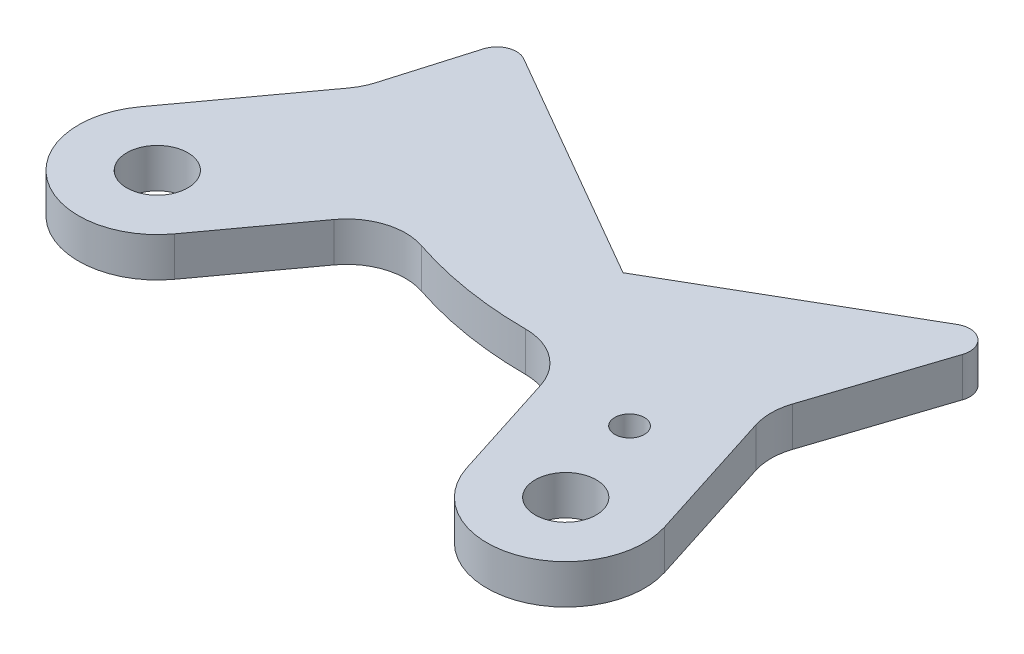
ISO-10303-21;
HEADER;
FILE_DESCRIPTION(('STEP AP214'),'2;1');
FILE_NAME('part.step','',(''),(''),'','','');
FILE_SCHEMA(('AUTOMOTIVE_DESIGN { 1 0 10303 214 1 1 1 1 }'));
ENDSEC;
DATA;
#1=APPLICATION_CONTEXT('core data for automotive mechanical design processes');
#2=APPLICATION_PROTOCOL_DEFINITION('international standard','automotive_design',2000,#1);
#3=PRODUCT_CONTEXT('',#1,'mechanical');
#4=PRODUCT('Part','Part','',(#3));
#5=PRODUCT_RELATED_PRODUCT_CATEGORY('part','',(#4));
#6=PRODUCT_DEFINITION_FORMATION('','',#4);
#7=PRODUCT_DEFINITION_CONTEXT('part definition',#1,'design');
#8=PRODUCT_DEFINITION('design','',#6,#7);
#9=PRODUCT_DEFINITION_SHAPE('','',#8);
#10=(LENGTH_UNIT() NAMED_UNIT(*) SI_UNIT(.MILLI.,.METRE.));
#11=(NAMED_UNIT(*) PLANE_ANGLE_UNIT() SI_UNIT($,.RADIAN.));
#12=(NAMED_UNIT(*) SI_UNIT($,.STERADIAN.) SOLID_ANGLE_UNIT());
#13=UNCERTAINTY_MEASURE_WITH_UNIT(LENGTH_MEASURE(1.E-05),#10,'distance_accuracy_value','');
#14=(GEOMETRIC_REPRESENTATION_CONTEXT(3) GLOBAL_UNCERTAINTY_ASSIGNED_CONTEXT((#13)) GLOBAL_UNIT_ASSIGNED_CONTEXT((#10,
#11,#12)) REPRESENTATION_CONTEXT('',''));
#15=CARTESIAN_POINT('',(0.,0.,0.));
#16=DIRECTION('',(0.,0.,1.));
#17=DIRECTION('',(1.,0.,0.));
#18=AXIS2_PLACEMENT_3D('',#15,#16,#17);
#19=CARTESIAN_POINT('',(-11.920981795953,2.,-8.70254765488495));
#20=DIRECTION('',(0.807679539292025,0.,0.589621710768033));
#21=DIRECTION('',(0.589621710768033,0.,-0.807679539292026));
#22=AXIS2_PLACEMENT_3D('',#19,#20,#21);
#23=PLANE('',#22);
#24=DIRECTION('',(-0.589621710768033,0.,0.807679539292026));
#25=VECTOR('',#24,1.);
#26=CARTESIAN_POINT('',(-11.920981795953,2.,-8.70254765488495));
#27=LINE('',#26,#25);
#28=CARTESIAN_POINT('',(-9.73497063871896,2.,-11.6970040192243));
#29=VERTEX_POINT('',#28);
#30=CARTESIAN_POINT('',(-14.2059725719786,2.,-5.57250636983299));
#31=VERTEX_POINT('',#30);
#32=EDGE_CURVE('E225',#29,#31,#27,.T.);
#33=ORIENTED_EDGE('',*,*,#32,.F.);
#34=DIRECTION('',(0.,-1.,0.));
#35=VECTOR('',#34,1.);
#36=CARTESIAN_POINT('',(-9.73497063871896,0.,-11.6970040192243));
#37=LINE('',#36,#35);
#38=CARTESIAN_POINT('',(-9.73497063871896,0.,-11.6970040192243));
#39=VERTEX_POINT('',#38);
#40=EDGE_CURVE('E305',#29,#39,#37,.T.);
#41=ORIENTED_EDGE('',*,*,#40,.T.);
#42=DIRECTION('',(-0.589621710768033,0.,0.807679539292026));
#43=VECTOR('',#42,1.);
#44=CARTESIAN_POINT('',(-11.920981795953,0.,-8.70254765488495));
#45=LINE('',#44,#43);
#46=CARTESIAN_POINT('',(-14.2059725719786,0.,-5.57250636983299));
#47=VERTEX_POINT('',#46);
#48=EDGE_CURVE('E215',#39,#47,#45,.T.);
#49=ORIENTED_EDGE('',*,*,#48,.T.);
#50=DIRECTION('',(0.,-1.,0.));
#51=VECTOR('',#50,1.);
#52=CARTESIAN_POINT('',(-14.2059725719786,2.,-5.57250636983299));
#53=LINE('',#52,#51);
#54=EDGE_CURVE('E301',#31,#47,#53,.T.);
#55=ORIENTED_EDGE('',*,*,#54,.F.);
#56=EDGE_LOOP('',(#33,#41,#49,#55));
#57=FACE_BOUND('',#56,.T.);
#58=ADVANCED_FACE('F58',(#57),#23,.F.);
#59=CARTESIAN_POINT('',(-10.9752544148105,2.,-3.21401952676085));
#60=DIRECTION('',(0.,-1.,0.));
#61=DIRECTION('',(0.,0.,-1.));
#62=AXIS2_PLACEMENT_3D('',#59,#60,#61);
#63=CYLINDRICAL_SURFACE('',#62,4.00000000000001);
#64=CARTESIAN_POINT('',(-10.9752544148105,0.,-3.21401952676085));
#65=DIRECTION('',(0.,1.,0.));
#66=DIRECTION('',(0.,0.,1.));
#67=AXIS2_PLACEMENT_3D('',#64,#65,#66);
#68=CIRCLE('',#67,4.00000000000001);
#69=CARTESIAN_POINT('',(-7.74453625764238,0.,-0.855532683688701));
#70=VERTEX_POINT('',#69);
#71=EDGE_CURVE('E262',#47,#70,#68,.T.);
#72=ORIENTED_EDGE('',*,*,#71,.T.);
#73=DIRECTION('',(0.,-1.,0.));
#74=VECTOR('',#73,1.);
#75=CARTESIAN_POINT('',(-7.74453625764238,2.,-0.855532683688701));
#76=LINE('',#75,#74);
#77=CARTESIAN_POINT('',(-7.74453625764238,2.,-0.855532683688701));
#78=VERTEX_POINT('',#77);
#79=EDGE_CURVE('E297',#78,#70,#76,.T.);
#80=ORIENTED_EDGE('',*,*,#79,.F.);
#81=CARTESIAN_POINT('',(-10.9752544148105,2.,-3.21401952676085));
#82=DIRECTION('',(0.,1.,0.));
#83=DIRECTION('',(0.,0.,1.));
#84=AXIS2_PLACEMENT_3D('',#81,#82,#83);
#85=CIRCLE('',#84,4.00000000000001);
#86=EDGE_CURVE('E228',#31,#78,#85,.T.);
#87=ORIENTED_EDGE('',*,*,#86,.F.);
#88=ORIENTED_EDGE('',*,*,#54,.T.);
#89=EDGE_LOOP('',(#72,#80,#87,#88));
#90=FACE_BOUND('',#89,.T.);
#91=ADVANCED_FACE('F422',(#90),#63,.T.);
#92=CARTESIAN_POINT('',(-5.45954548161673,2.,-3.98557396874065));
#93=DIRECTION('',(-0.807679539292025,0.,-0.589621710768033));
#94=DIRECTION('',(-0.589621710768033,0.,0.807679539292025));
#95=AXIS2_PLACEMENT_3D('',#92,#93,#94);
#96=PLANE('',#95);
#97=DIRECTION('',(0.589621710768033,0.,-0.807679539292025));
#98=VECTOR('',#97,1.);
#99=CARTESIAN_POINT('',(-5.45954548161673,0.,-3.98557396874065));
#100=LINE('',#99,#98);
#101=CARTESIAN_POINT('',(-4.32997932465112,0.,-5.53288380587244));
#102=VERTEX_POINT('',#101);
#103=EDGE_CURVE('E265',#70,#102,#100,.T.);
#104=ORIENTED_EDGE('',*,*,#103,.T.);
#105=DIRECTION('',(0.,1.,0.));
#106=VECTOR('',#105,1.);
#107=CARTESIAN_POINT('',(-4.32997932465112,2.,-5.53288380587244));
#108=LINE('',#107,#106);
#109=CARTESIAN_POINT('',(-4.32997932465112,2.,-5.53288380587244));
#110=VERTEX_POINT('',#109);
#111=EDGE_CURVE('E319',#102,#110,#108,.T.);
#112=ORIENTED_EDGE('',*,*,#111,.T.);
#113=DIRECTION('',(0.589621710768033,0.,-0.807679539292025));
#114=VECTOR('',#113,1.);
#115=CARTESIAN_POINT('',(-5.45954548161673,2.,-3.98557396874065));
#116=LINE('',#115,#114);
#117=EDGE_CURVE('E232',#78,#110,#116,.T.);
#118=ORIENTED_EDGE('',*,*,#117,.F.);
#119=ORIENTED_EDGE('',*,*,#79,.T.);
#120=EDGE_LOOP('',(#104,#112,#118,#119));
#121=FACE_BOUND('',#120,.T.);
#122=ADVANCED_FACE('F417',(#121),#96,.F.);
#123=CARTESIAN_POINT('',(5.35726697347827,2.,-25.5867427651695));
#124=DIRECTION('',(0.,-1.,0.));
#125=DIRECTION('',(0.,0.,-1.));
#126=AXIS2_PLACEMENT_3D('',#123,#124,#125);
#127=CYLINDRICAL_SURFACE('',#126,20.);
#128=CARTESIAN_POINT('',(5.35726697347827,2.,-25.5867427651695));
#129=DIRECTION('',(0.,1.,0.));
#130=DIRECTION('',(0.,0.,1.));
#131=AXIS2_PLACEMENT_3D('',#128,#129,#130);
#132=CIRCLE('',#131,20.);
#133=CARTESIAN_POINT('',(-0.959435357176782,2.,-6.61046094638588));
#134=VERTEX_POINT('',#133);
#135=CARTESIAN_POINT('',(5.35473098050555,2.,-5.58674292595099));
#136=VERTEX_POINT('',#135);
#137=EDGE_CURVE('E236',#134,#136,#132,.T.);
#138=ORIENTED_EDGE('',*,*,#137,.F.);
#139=DIRECTION('',(0.,-1.,0.));
#140=VECTOR('',#139,1.);
#141=CARTESIAN_POINT('',(-0.959435357176783,2.,-6.61046094638587));
#142=LINE('',#141,#140);
#143=CARTESIAN_POINT('',(-0.959435357176782,0.,-6.61046094638588));
#144=VERTEX_POINT('',#143);
#145=EDGE_CURVE('E315',#134,#144,#142,.T.);
#146=ORIENTED_EDGE('',*,*,#145,.T.);
#147=CARTESIAN_POINT('',(5.35726697347827,0.,-25.5867427651695));
#148=DIRECTION('',(0.,1.,0.));
#149=DIRECTION('',(0.,0.,1.));
#150=AXIS2_PLACEMENT_3D('',#147,#148,#149);
#151=CIRCLE('',#150,20.);
#152=CARTESIAN_POINT('',(5.35473098050555,0.,-5.58674292595099));
#153=VERTEX_POINT('',#152);
#154=EDGE_CURVE('E269',#144,#153,#151,.T.);
#155=ORIENTED_EDGE('',*,*,#154,.T.);
#156=DIRECTION('',(0.,-1.,0.));
#157=VECTOR('',#156,1.);
#158=CARTESIAN_POINT('',(5.35473098050555,2.,-5.58674292595099));
#159=LINE('',#158,#157);
#160=EDGE_CURVE('E312',#153,#136,#159,.F.);
#161=ORIENTED_EDGE('',*,*,#160,.T.);
#162=EDGE_LOOP('',(#138,#146,#155,#161));
#163=FACE_BOUND('',#162,.T.);
#164=ADVANCED_FACE('F408',(#163),#127,.T.);
#165=CARTESIAN_POINT('',(8.46623721619208,2.,-2.70382058589086));
#166=DIRECTION('',(-0.952599553113903,0.,0.304227039244038));
#167=DIRECTION('',(0.304227039244038,0.,0.952599553113903));
#168=AXIS2_PLACEMENT_3D('',#165,#166,#167);
#169=PLANE('',#168);
#170=DIRECTION('',(-0.304227039244038,0.,-0.952599553113902));
#171=VECTOR('',#170,1.);
#172=CARTESIAN_POINT('',(8.46623721619208,2.,-2.70382058589086));
#173=LINE('',#172,#171);
#174=CARTESIAN_POINT('',(9.97395774809266,2.,2.01717301309372));
#175=VERTEX_POINT('',#174);
#176=CARTESIAN_POINT('',(8.21214924090135,2.,-3.49942406780033));
#177=VERTEX_POINT('',#176);
#178=EDGE_CURVE('E240',#175,#177,#173,.T.);
#179=ORIENTED_EDGE('',*,*,#178,.T.);
#180=DIRECTION('',(0.,-1.,0.));
#181=VECTOR('',#180,1.);
#182=CARTESIAN_POINT('',(8.21214924090135,2.,-3.49942406780033));
#183=LINE('',#182,#181);
#184=CARTESIAN_POINT('',(8.21214924090135,0.,-3.49942406780033));
#185=VERTEX_POINT('',#184);
#186=EDGE_CURVE('E322',#177,#185,#183,.T.);
#187=ORIENTED_EDGE('',*,*,#186,.T.);
#188=DIRECTION('',(-0.304227039244038,0.,-0.952599553113902));
#189=VECTOR('',#188,1.);
#190=CARTESIAN_POINT('',(8.46623721619208,0.,-2.70382058589086));
#191=LINE('',#190,#189);
#192=CARTESIAN_POINT('',(9.97395774809266,0.,2.01717301309372));
#193=VERTEX_POINT('',#192);
#194=EDGE_CURVE('E273',#193,#185,#191,.T.);
#195=ORIENTED_EDGE('',*,*,#194,.F.);
#196=DIRECTION('',(0.,-1.,0.));
#197=VECTOR('',#196,1.);
#198=CARTESIAN_POINT('',(9.97395774809266,2.,2.01717301309372));
#199=LINE('',#198,#197);
#200=EDGE_CURVE('E294',#175,#193,#199,.T.);
#201=ORIENTED_EDGE('',*,*,#200,.F.);
#202=EDGE_LOOP('',(#179,#187,#195,#201));
#203=FACE_BOUND('',#202,.T.);
#204=ADVANCED_FACE('F399',(#203),#169,.T.);
#205=CARTESIAN_POINT('',(13.7843559605483,2.,0.800264856117561));
#206=DIRECTION('',(0.,-1.,0.));
#207=DIRECTION('',(0.,0.,-1.));
#208=AXIS2_PLACEMENT_3D('',#205,#206,#207);
#209=CYLINDRICAL_SURFACE('',#208,4.00000000000002);
#210=CARTESIAN_POINT('',(13.7843559605483,0.,0.800264856117561));
#211=DIRECTION('',(0.,1.,0.));
#212=DIRECTION('',(0.,0.,1.));
#213=AXIS2_PLACEMENT_3D('',#210,#211,#212);
#214=CIRCLE('',#213,4.00000000000002);
#215=CARTESIAN_POINT('',(17.5947541730039,0.,-0.416643300858593));
#216=VERTEX_POINT('',#215);
#217=EDGE_CURVE('E277',#193,#216,#214,.T.);
#218=ORIENTED_EDGE('',*,*,#217,.T.);
#219=DIRECTION('',(0.,-1.,0.));
#220=VECTOR('',#219,1.);
#221=CARTESIAN_POINT('',(17.5947541730039,2.,-0.416643300858593));
#222=LINE('',#221,#220);
#223=CARTESIAN_POINT('',(17.5947541730039,2.,-0.416643300858593));
#224=VERTEX_POINT('',#223);
#225=EDGE_CURVE('E259',#224,#216,#222,.T.);
#226=ORIENTED_EDGE('',*,*,#225,.F.);
#227=CARTESIAN_POINT('',(13.7843559605483,2.,0.800264856117561));
#228=DIRECTION('',(0.,1.,0.));
#229=DIRECTION('',(0.,0.,1.));
#230=AXIS2_PLACEMENT_3D('',#227,#228,#229);
#231=CIRCLE('',#230,4.00000000000002);
#232=EDGE_CURVE('E244',#175,#224,#231,.T.);
#233=ORIENTED_EDGE('',*,*,#232,.F.);
#234=ORIENTED_EDGE('',*,*,#200,.T.);
#235=EDGE_LOOP('',(#218,#226,#233,#234));
#236=FACE_BOUND('',#235,.T.);
#237=ADVANCED_FACE('F395',(#236),#209,.T.);
#238=CARTESIAN_POINT('',(16.0870336411034,2.,-5.13763689984319));
#239=DIRECTION('',(-0.952599553113902,0.,0.304227039244038));
#240=DIRECTION('',(0.304227039244038,0.,0.952599553113902));
#241=AXIS2_PLACEMENT_3D('',#238,#239,#240);
#242=PLANE('',#241);
#243=DIRECTION('',(-0.304227039244038,0.,-0.952599553113903));
#244=VECTOR('',#243,1.);
#245=CARTESIAN_POINT('',(16.0870336411034,0.,-5.13763689984319));
#246=LINE('',#245,#244);
#247=CARTESIAN_POINT('',(15.4249727186927,0.,-7.21069043377549));
#248=VERTEX_POINT('',#247);
#249=EDGE_CURVE('E280',#216,#248,#246,.T.);
#250=ORIENTED_EDGE('',*,*,#249,.T.);
#251=DIRECTION('',(0.,-1.,0.));
#252=VECTOR('',#251,1.);
#253=CARTESIAN_POINT('',(15.4249727186927,2.,-7.21069043377549));
#254=LINE('',#253,#252);
#255=CARTESIAN_POINT('',(15.4249727186927,2.,-7.21069043377549));
#256=VERTEX_POINT('',#255);
#257=EDGE_CURVE('E330',#248,#256,#254,.F.);
#258=ORIENTED_EDGE('',*,*,#257,.T.);
#259=DIRECTION('',(-0.304227039244038,0.,-0.952599553113903));
#260=VECTOR('',#259,1.);
#261=CARTESIAN_POINT('',(16.0870336411034,2.,-5.13763689984319));
#262=LINE('',#261,#260);
#263=EDGE_CURVE('E247',#224,#256,#262,.T.);
#264=ORIENTED_EDGE('',*,*,#263,.F.);
#265=ORIENTED_EDGE('',*,*,#225,.T.);
#266=EDGE_LOOP('',(#250,#258,#264,#265));
#267=FACE_BOUND('',#266,.T.);
#268=ADVANCED_FACE('F391',(#267),#242,.F.);
#269=CARTESIAN_POINT('',(13.7843559605483,2.,0.800264856117561));
#270=DIRECTION('',(0.,-1.,0.));
#271=DIRECTION('',(0.,0.,-1.));
#272=AXIS2_PLACEMENT_3D('',#269,#270,#271);
#273=CYLINDRICAL_SURFACE('',#272,1.55);
#274=CARTESIAN_POINT('',(13.7843559605483,2.,0.800264856117561));
#275=DIRECTION('',(0.,1.,0.));
#276=DIRECTION('',(0.,0.,1.));
#277=AXIS2_PLACEMENT_3D('',#274,#275,#276);
#278=CIRCLE('',#277,1.55);
#279=CARTESIAN_POINT('',(13.7843559605483,2.,2.35026485611756));
#280=VERTEX_POINT('',#279);
#281=EDGE_CURVE('E251',#280,#280,#278,.T.);
#282=ORIENTED_EDGE('',*,*,#281,.T.);
#283=EDGE_LOOP('',(#282));
#284=FACE_BOUND('',#283,.T.);
#285=CARTESIAN_POINT('',(13.7843559605483,0.,0.800264856117561));
#286=DIRECTION('',(0.,1.,0.));
#287=DIRECTION('',(0.,0.,1.));
#288=AXIS2_PLACEMENT_3D('',#285,#286,#287);
#289=CIRCLE('',#288,1.55);
#290=CARTESIAN_POINT('',(13.7843559605483,0.,2.35026485611756));
#291=VERTEX_POINT('',#290);
#292=EDGE_CURVE('E284',#291,#291,#289,.T.);
#293=ORIENTED_EDGE('',*,*,#292,.F.);
#294=EDGE_LOOP('',(#293));
#295=FACE_BOUND('',#294,.T.);
#296=ADVANCED_FACE('F601',(#284,#295),#273,.F.);
#297=CARTESIAN_POINT('',(-10.9752544148105,2.,-3.21401952676085));
#298=DIRECTION('',(0.,-1.,0.));
#299=DIRECTION('',(0.,0.,-1.));
#300=AXIS2_PLACEMENT_3D('',#297,#298,#299);
#301=CYLINDRICAL_SURFACE('',#300,1.55);
#302=CARTESIAN_POINT('',(-10.9752544148105,2.,-3.21401952676085));
#303=DIRECTION('',(0.,1.,0.));
#304=DIRECTION('',(0.,0.,1.));
#305=AXIS2_PLACEMENT_3D('',#302,#303,#304);
#306=CIRCLE('',#305,1.55);
#307=CARTESIAN_POINT('',(-10.9752544148105,2.,-1.66401952676085));
#308=VERTEX_POINT('',#307);
#309=EDGE_CURVE('E255',#308,#308,#306,.T.);
#310=ORIENTED_EDGE('',*,*,#309,.T.);
#311=EDGE_LOOP('',(#310));
#312=FACE_BOUND('',#311,.T.);
#313=CARTESIAN_POINT('',(-10.9752544148105,0.,-3.21401952676085));
#314=DIRECTION('',(0.,1.,0.));
#315=DIRECTION('',(0.,0.,1.));
#316=AXIS2_PLACEMENT_3D('',#313,#314,#315);
#317=CIRCLE('',#316,1.55);
#318=CARTESIAN_POINT('',(-10.9752544148105,0.,-1.66401952676085));
#319=VERTEX_POINT('',#318);
#320=EDGE_CURVE('E229',#319,#319,#317,.T.);
#321=ORIENTED_EDGE('',*,*,#320,.F.);
#322=EDGE_LOOP('',(#321));
#323=FACE_BOUND('',#322,.T.);
#324=ADVANCED_FACE('F530',(#312,#323),#301,.F.);
#325=CARTESIAN_POINT('',(0.,2.,0.));
#326=DIRECTION('',(0.,1.,0.));
#327=DIRECTION('',(0.,0.,1.));
#328=AXIS2_PLACEMENT_3D('',#325,#326,#327);
#329=PLANE('',#328);
#330=CARTESIAN_POINT('',(12.2632207643281,2.,-3.96273290945195));
#331=DIRECTION('',(0.,1.,0.));
#332=DIRECTION('',(0.,0.,1.));
#333=AXIS2_PLACEMENT_3D('',#330,#331,#332);
#334=CIRCLE('',#333,0.75);
#335=CARTESIAN_POINT('',(12.2632207643281,2.,-3.21273290945195));
#336=VERTEX_POINT('',#335);
#337=EDGE_CURVE('E206',#336,#336,#334,.T.);
#338=ORIENTED_EDGE('',*,*,#337,.F.);
#339=EDGE_LOOP('',(#338));
#340=FACE_BOUND('',#339,.T.);
#341=DIRECTION('',(0.866025403784439,0.,0.5));
#342=VECTOR('',#341,1.);
#343=CARTESIAN_POINT('',(5.90186019725889,2.,-10.2223217208209));
#344=LINE('',#343,#342);
#345=CARTESIAN_POINT('',(-6.57622253757224,2.,-17.4265461467461));
#346=VERTEX_POINT('',#345);
#347=CARTESIAN_POINT('',(5.35726697347828,2.,-10.5367427651695));
#348=VERTEX_POINT('',#347);
#349=EDGE_CURVE('E179',#346,#348,#344,.T.);
#350=ORIENTED_EDGE('',*,*,#349,.F.);
#351=CARTESIAN_POINT('',(-7.07622253757224,2.,-16.5605207429616));
#352=DIRECTION('',(0.,1.,0.));
#353=DIRECTION('',(0.,0.,1.));
#354=AXIS2_PLACEMENT_3D('',#351,#352,#353);
#355=CIRCLE('',#354,1.);
#356=CARTESIAN_POINT('',(-8.03545437580635,2.,-16.8431411253087));
#357=VERTEX_POINT('',#356);
#358=EDGE_CURVE('E362',#346,#357,#355,.T.);
#359=ORIENTED_EDGE('',*,*,#358,.T.);
#360=DIRECTION('',(0.282620382347096,0.,-0.959231838234106));
#361=VECTOR('',#360,1.);
#362=CARTESIAN_POINT('',(-11.9597780091251,2.,-3.52373315709357));
#363=LINE('',#362,#361);
#364=CARTESIAN_POINT('',(-9.28031374189272,2.,-12.6180080044871));
#365=VERTEX_POINT('',#364);
#366=EDGE_CURVE('E216',#365,#357,#363,.T.);
#367=ORIENTED_EDGE('',*,*,#366,.F.);
#368=CARTESIAN_POINT('',(-12.158009256595,2.,-13.4658691515284));
#369=DIRECTION('',(0.,1.,0.));
#370=DIRECTION('',(0.,0.,1.));
#371=AXIS2_PLACEMENT_3D('',#368,#369,#370);
#372=CIRCLE('',#371,3.);
#373=EDGE_CURVE('E336',#365,#29,#372,.F.);
#374=ORIENTED_EDGE('',*,*,#373,.T.);
#375=ORIENTED_EDGE('',*,*,#32,.T.);
#376=ORIENTED_EDGE('',*,*,#86,.T.);
#377=ORIENTED_EDGE('',*,*,#117,.T.);
#378=CARTESIAN_POINT('',(-1.90694070677504,2.,-3.76401867356834));
#379=DIRECTION('',(0.,1.,0.));
#380=DIRECTION('',(0.,0.,1.));
#381=AXIS2_PLACEMENT_3D('',#378,#379,#380);
#382=CIRCLE('',#381,3.);
#383=EDGE_CURVE('E342',#110,#134,#382,.F.);
#384=ORIENTED_EDGE('',*,*,#383,.T.);
#385=ORIENTED_EDGE('',*,*,#137,.T.);
#386=CARTESIAN_POINT('',(5.35435058155964,2.,-2.58674295006821));
#387=DIRECTION('',(0.,1.,0.));
#388=DIRECTION('',(0.,0.,1.));
#389=AXIS2_PLACEMENT_3D('',#386,#387,#388);
#390=CIRCLE('',#389,3.);
#391=EDGE_CURVE('E348',#136,#177,#390,.F.);
#392=ORIENTED_EDGE('',*,*,#391,.T.);
#393=ORIENTED_EDGE('',*,*,#178,.F.);
#394=ORIENTED_EDGE('',*,*,#232,.T.);
#395=ORIENTED_EDGE('',*,*,#263,.T.);
#396=CARTESIAN_POINT('',(18.2827713780344,2.,-8.1233715515076));
#397=DIRECTION('',(0.,1.,0.));
#398=DIRECTION('',(0.,0.,1.));
#399=AXIS2_PLACEMENT_3D('',#396,#397,#398);
#400=CIRCLE('',#399,3.);
#401=CARTESIAN_POINT('',(15.432723296155,2.,-9.05997495262037));
#402=VERTEX_POINT('',#401);
#403=EDGE_CURVE('E354',#256,#402,#400,.F.);
#404=ORIENTED_EDGE('',*,*,#403,.T.);
#405=DIRECTION('',(-0.312201133704257,0.,0.950016027293106));
#406=VECTOR('',#405,1.);
#407=CARTESIAN_POINT('',(11.2413496711117,2.,3.69421358257174));
#408=LINE('',#407,#406);
#409=CARTESIAN_POINT('',(17.5735480559117,2.,-15.5744222554329));
#410=VERTEX_POINT('',#409);
#411=EDGE_CURVE('E209',#410,#402,#408,.T.);
#412=ORIENTED_EDGE('',*,*,#411,.F.);
#413=CARTESIAN_POINT('',(16.6235320286186,2.,-15.8866233891371));
#414=DIRECTION('',(0.,1.,0.));
#415=DIRECTION('',(0.,0.,1.));
#416=AXIS2_PLACEMENT_3D('',#413,#414,#415);
#417=CIRCLE('',#416,1.);
#418=CARTESIAN_POINT('',(16.1235320286186,2.,-16.7526487929216));
#419=VERTEX_POINT('',#418);
#420=EDGE_CURVE('E200',#410,#419,#417,.T.);
#421=ORIENTED_EDGE('',*,*,#420,.T.);
#422=DIRECTION('',(0.866025403784439,0.,-0.5));
#423=VECTOR('',#422,1.);
#424=CARTESIAN_POINT('',(-3.22322671051976,2.,-5.58279242693332));
#425=LINE('',#424,#423);
#426=EDGE_CURVE('E189',#348,#419,#425,.T.);
#427=ORIENTED_EDGE('',*,*,#426,.F.);
#428=EDGE_LOOP('',(#350,#359,#367,#374,#375,#376,#377,#384,#385,#392,#393,#394,#395,#404,#412,
#421,#427));
#429=FACE_BOUND('',#428,.T.);
#430=ORIENTED_EDGE('',*,*,#281,.F.);
#431=EDGE_LOOP('',(#430));
#432=FACE_BOUND('',#431,.T.);
#433=ORIENTED_EDGE('',*,*,#309,.F.);
#434=EDGE_LOOP('',(#433));
#435=FACE_BOUND('',#434,.T.);
#436=ADVANCED_FACE('F197',(#340,#429,#432,#435),#329,.T.);
#437=CARTESIAN_POINT('',(0.,0.,0.));
#438=DIRECTION('',(0.,1.,0.));
#439=DIRECTION('',(0.,0.,1.));
#440=AXIS2_PLACEMENT_3D('',#437,#438,#439);
#441=PLANE('',#440);
#442=CARTESIAN_POINT('',(12.2632207643281,0.,-3.96273290945195));
#443=DIRECTION('',(0.,1.,0.));
#444=DIRECTION('',(0.,0.,1.));
#445=AXIS2_PLACEMENT_3D('',#442,#443,#444);
#446=CIRCLE('',#445,0.75);
#447=CARTESIAN_POINT('',(12.2632207643281,0.,-3.21273290945195));
#448=VERTEX_POINT('',#447);
#449=EDGE_CURVE('E62',#448,#448,#446,.T.);
#450=ORIENTED_EDGE('',*,*,#449,.T.);
#451=EDGE_LOOP('',(#450));
#452=FACE_BOUND('',#451,.T.);
#453=DIRECTION('',(0.282620382347096,0.,-0.959231838234106));
#454=VECTOR('',#453,1.);
#455=CARTESIAN_POINT('',(-11.9597780091251,0.,-3.52373315709357));
#456=LINE('',#455,#454);
#457=CARTESIAN_POINT('',(-9.28031374189272,0.,-12.6180080044871));
#458=VERTEX_POINT('',#457);
#459=CARTESIAN_POINT('',(-8.03545437580635,0.,-16.8431411253087));
#460=VERTEX_POINT('',#459);
#461=EDGE_CURVE('E211',#458,#460,#456,.T.);
#462=ORIENTED_EDGE('',*,*,#461,.T.);
#463=CARTESIAN_POINT('',(-7.07622253757224,0.,-16.5605207429616));
#464=DIRECTION('',(0.,1.,0.));
#465=DIRECTION('',(0.,0.,1.));
#466=AXIS2_PLACEMENT_3D('',#463,#464,#465);
#467=CIRCLE('',#466,1.);
#468=CARTESIAN_POINT('',(-6.57622253757224,0.,-17.4265461467461));
#469=VERTEX_POINT('',#468);
#470=EDGE_CURVE('E370',#460,#469,#467,.F.);
#471=ORIENTED_EDGE('',*,*,#470,.T.);
#472=DIRECTION('',(-0.866025403784439,0.,-0.5));
#473=VECTOR('',#472,1.);
#474=CARTESIAN_POINT('',(5.90186019725889,0.,-10.2223217208209));
#475=LINE('',#474,#473);
#476=CARTESIAN_POINT('',(5.35726697347827,0.,-10.5367427651695));
#477=VERTEX_POINT('',#476);
#478=EDGE_CURVE('E195',#477,#469,#475,.T.);
#479=ORIENTED_EDGE('',*,*,#478,.F.);
#480=DIRECTION('',(-0.866025403784439,0.,0.5));
#481=VECTOR('',#480,1.);
#482=CARTESIAN_POINT('',(-3.22322671051976,0.,-5.58279242693332));
#483=LINE('',#482,#481);
#484=CARTESIAN_POINT('',(16.1235320286186,0.,-16.7526487929216));
#485=VERTEX_POINT('',#484);
#486=EDGE_CURVE('E192',#485,#477,#483,.T.);
#487=ORIENTED_EDGE('',*,*,#486,.F.);
#488=CARTESIAN_POINT('',(16.6235320286186,0.,-15.8866233891371));
#489=DIRECTION('',(0.,1.,0.));
#490=DIRECTION('',(0.,0.,1.));
#491=AXIS2_PLACEMENT_3D('',#488,#489,#490);
#492=CIRCLE('',#491,1.);
#493=CARTESIAN_POINT('',(17.5735480559117,0.,-15.5744222554329));
#494=VERTEX_POINT('',#493);
#495=EDGE_CURVE('E75',#485,#494,#492,.F.);
#496=ORIENTED_EDGE('',*,*,#495,.T.);
#497=DIRECTION('',(-0.312201133704257,0.,0.950016027293106));
#498=VECTOR('',#497,1.);
#499=CARTESIAN_POINT('',(11.2413496711117,0.,3.69421358257174));
#500=LINE('',#499,#498);
#501=CARTESIAN_POINT('',(15.432723296155,0.,-9.05997495262037));
#502=VERTEX_POINT('',#501);
#503=EDGE_CURVE('E220',#494,#502,#500,.T.);
#504=ORIENTED_EDGE('',*,*,#503,.T.);
#505=CARTESIAN_POINT('',(18.2827713780344,0.,-8.1233715515076));
#506=DIRECTION('',(0.,1.,0.));
#507=DIRECTION('',(0.,0.,1.));
#508=AXIS2_PLACEMENT_3D('',#505,#506,#507);
#509=CIRCLE('',#508,3.);
#510=EDGE_CURVE('E351',#502,#248,#509,.T.);
#511=ORIENTED_EDGE('',*,*,#510,.T.);
#512=ORIENTED_EDGE('',*,*,#249,.F.);
#513=ORIENTED_EDGE('',*,*,#217,.F.);
#514=ORIENTED_EDGE('',*,*,#194,.T.);
#515=CARTESIAN_POINT('',(5.35435058155964,0.,-2.58674295006821));
#516=DIRECTION('',(0.,1.,0.));
#517=DIRECTION('',(0.,0.,1.));
#518=AXIS2_PLACEMENT_3D('',#515,#516,#517);
#519=CIRCLE('',#518,3.);
#520=EDGE_CURVE('E345',#185,#153,#519,.T.);
#521=ORIENTED_EDGE('',*,*,#520,.T.);
#522=ORIENTED_EDGE('',*,*,#154,.F.);
#523=CARTESIAN_POINT('',(-1.90694070677504,0.,-3.76401867356834));
#524=DIRECTION('',(0.,1.,0.));
#525=DIRECTION('',(0.,0.,1.));
#526=AXIS2_PLACEMENT_3D('',#523,#524,#525);
#527=CIRCLE('',#526,3.);
#528=EDGE_CURVE('E339',#144,#102,#527,.T.);
#529=ORIENTED_EDGE('',*,*,#528,.T.);
#530=ORIENTED_EDGE('',*,*,#103,.F.);
#531=ORIENTED_EDGE('',*,*,#71,.F.);
#532=ORIENTED_EDGE('',*,*,#48,.F.);
#533=CARTESIAN_POINT('',(-12.158009256595,0.,-13.4658691515284));
#534=DIRECTION('',(0.,1.,0.));
#535=DIRECTION('',(0.,0.,1.));
#536=AXIS2_PLACEMENT_3D('',#533,#534,#535);
#537=CIRCLE('',#536,3.);
#538=EDGE_CURVE('E333',#39,#458,#537,.T.);
#539=ORIENTED_EDGE('',*,*,#538,.T.);
#540=EDGE_LOOP('',(#462,#471,#479,#487,#496,#504,#511,#512,#513,#514,#521,#522,#529,#530,#531,
#532,#539));
#541=FACE_BOUND('',#540,.T.);
#542=ORIENTED_EDGE('',*,*,#292,.T.);
#543=EDGE_LOOP('',(#542));
#544=FACE_BOUND('',#543,.T.);
#545=ORIENTED_EDGE('',*,*,#320,.T.);
#546=EDGE_LOOP('',(#545));
#547=FACE_BOUND('',#546,.T.);
#548=ADVANCED_FACE('F387',(#452,#541,#544,#547),#441,.F.);
#549=CARTESIAN_POINT('',(11.2413496711117,0.,3.69421358257174));
#550=DIRECTION('',(-0.950016027293106,0.,-0.312201133704258));
#551=DIRECTION('',(-0.312201133704258,0.,0.950016027293106));
#552=AXIS2_PLACEMENT_3D('',#549,#550,#551);
#553=PLANE('',#552);
#554=ORIENTED_EDGE('',*,*,#503,.F.);
#555=DIRECTION('',(0.,1.,0.));
#556=VECTOR('',#555,1.);
#557=CARTESIAN_POINT('',(17.5735480559117,0.,-15.5744222554329));
#558=LINE('',#557,#556);
#559=EDGE_CURVE('E68',#494,#410,#558,.T.);
#560=ORIENTED_EDGE('',*,*,#559,.T.);
#561=ORIENTED_EDGE('',*,*,#411,.T.);
#562=DIRECTION('',(0.,-1.,0.));
#563=VECTOR('',#562,1.);
#564=CARTESIAN_POINT('',(15.432723296155,0.,-9.05997495262038));
#565=LINE('',#564,#563);
#566=EDGE_CURVE('E326',#402,#502,#565,.T.);
#567=ORIENTED_EDGE('',*,*,#566,.T.);
#568=EDGE_LOOP('',(#554,#560,#561,#567));
#569=FACE_BOUND('',#568,.T.);
#570=ADVANCED_FACE('F377',(#569),#553,.F.);
#571=CARTESIAN_POINT('',(-11.9597780091251,0.,-3.52373315709357));
#572=DIRECTION('',(0.959231838234106,0.,0.282620382347096));
#573=DIRECTION('',(0.282620382347096,0.,-0.959231838234106));
#574=AXIS2_PLACEMENT_3D('',#571,#572,#573);
#575=PLANE('',#574);
#576=ORIENTED_EDGE('',*,*,#366,.T.);
#577=DIRECTION('',(0.,1.,0.));
#578=VECTOR('',#577,1.);
#579=CARTESIAN_POINT('',(-8.03545437580635,0.,-16.8431411253087));
#580=LINE('',#579,#578);
#581=EDGE_CURVE('E365',#357,#460,#580,.F.);
#582=ORIENTED_EDGE('',*,*,#581,.T.);
#583=ORIENTED_EDGE('',*,*,#461,.F.);
#584=DIRECTION('',(0.,-1.,0.));
#585=VECTOR('',#584,1.);
#586=CARTESIAN_POINT('',(-9.28031374189272,2.,-12.6180080044871));
#587=LINE('',#586,#585);
#588=EDGE_CURVE('E309',#458,#365,#587,.F.);
#589=ORIENTED_EDGE('',*,*,#588,.T.);
#590=EDGE_LOOP('',(#576,#582,#583,#589));
#591=FACE_BOUND('',#590,.T.);
#592=ADVANCED_FACE('F435',(#591),#575,.F.);
#593=CARTESIAN_POINT('',(5.90186019725889,-15.05,-10.2223217208209));
#594=DIRECTION('',(-0.5,0.,0.866025403784439));
#595=DIRECTION('',(0.866025403784439,0.,0.5));
#596=AXIS2_PLACEMENT_3D('',#593,#594,#595);
#597=PLANE('',#596);
#598=ORIENTED_EDGE('',*,*,#478,.T.);
#599=DIRECTION('',(0.,1.,0.));
#600=VECTOR('',#599,1.);
#601=CARTESIAN_POINT('',(-6.57622253757224,-15.05,-17.4265461467461));
#602=LINE('',#601,#600);
#603=EDGE_CURVE('E185',#469,#346,#602,.T.);
#604=ORIENTED_EDGE('',*,*,#603,.T.);
#605=ORIENTED_EDGE('',*,*,#349,.T.);
#606=DIRECTION('',(0.,1.,0.));
#607=VECTOR('',#606,1.);
#608=CARTESIAN_POINT('',(5.35726697347828,-15.05,-10.5367427651695));
#609=LINE('',#608,#607);
#610=EDGE_CURVE('E183',#477,#348,#609,.T.);
#611=ORIENTED_EDGE('',*,*,#610,.F.);
#612=EDGE_LOOP('',(#598,#604,#605,#611));
#613=FACE_BOUND('',#612,.T.);
#614=ADVANCED_FACE('F182',(#613),#597,.F.);
#615=CARTESIAN_POINT('',(-3.22322671051976,-15.05,-5.58279242693332));
#616=DIRECTION('',(0.5,0.,0.866025403784439));
#617=DIRECTION('',(0.866025403784439,0.,-0.5));
#618=AXIS2_PLACEMENT_3D('',#615,#616,#617);
#619=PLANE('',#618);
#620=ORIENTED_EDGE('',*,*,#426,.T.);
#621=DIRECTION('',(0.,1.,0.));
#622=VECTOR('',#621,1.);
#623=CARTESIAN_POINT('',(16.1235320286186,-15.05,-16.7526487929216));
#624=LINE('',#623,#622);
#625=EDGE_CURVE('E12',#419,#485,#624,.F.);
#626=ORIENTED_EDGE('',*,*,#625,.T.);
#627=ORIENTED_EDGE('',*,*,#486,.T.);
#628=ORIENTED_EDGE('',*,*,#610,.T.);
#629=EDGE_LOOP('',(#620,#626,#627,#628));
#630=FACE_BOUND('',#629,.T.);
#631=ADVANCED_FACE('F191',(#630),#619,.F.);
#632=CARTESIAN_POINT('',(-12.158009256595,2.,-13.4658691515284));
#633=DIRECTION('',(0.,1.,0.));
#634=DIRECTION('',(0.,0.,1.));
#635=AXIS2_PLACEMENT_3D('',#632,#633,#634);
#636=CYLINDRICAL_SURFACE('',#635,3.);
#637=ORIENTED_EDGE('',*,*,#373,.F.);
#638=ORIENTED_EDGE('',*,*,#588,.F.);
#639=ORIENTED_EDGE('',*,*,#538,.F.);
#640=ORIENTED_EDGE('',*,*,#40,.F.);
#641=EDGE_LOOP('',(#637,#638,#639,#640));
#642=FACE_BOUND('',#641,.T.);
#643=ADVANCED_FACE('F431',(#642),#636,.F.);
#644=CARTESIAN_POINT('',(-1.90694070677504,2.,-3.76401867356834));
#645=DIRECTION('',(0.,-1.,0.));
#646=DIRECTION('',(0.,0.,-1.));
#647=AXIS2_PLACEMENT_3D('',#644,#645,#646);
#648=CYLINDRICAL_SURFACE('',#647,3.);
#649=ORIENTED_EDGE('',*,*,#383,.F.);
#650=ORIENTED_EDGE('',*,*,#111,.F.);
#651=ORIENTED_EDGE('',*,*,#528,.F.);
#652=ORIENTED_EDGE('',*,*,#145,.F.);
#653=EDGE_LOOP('',(#649,#650,#651,#652));
#654=FACE_BOUND('',#653,.T.);
#655=ADVANCED_FACE('F412',(#654),#648,.F.);
#656=CARTESIAN_POINT('',(5.35435058155964,2.,-2.58674295006821));
#657=DIRECTION('',(0.,-1.,0.));
#658=DIRECTION('',(0.,0.,-1.));
#659=AXIS2_PLACEMENT_3D('',#656,#657,#658);
#660=CYLINDRICAL_SURFACE('',#659,3.);
#661=ORIENTED_EDGE('',*,*,#391,.F.);
#662=ORIENTED_EDGE('',*,*,#160,.F.);
#663=ORIENTED_EDGE('',*,*,#520,.F.);
#664=ORIENTED_EDGE('',*,*,#186,.F.);
#665=EDGE_LOOP('',(#661,#662,#663,#664));
#666=FACE_BOUND('',#665,.T.);
#667=ADVANCED_FACE('F403',(#666),#660,.F.);
#668=CARTESIAN_POINT('',(18.2827713780344,0.,-8.1233715515076));
#669=DIRECTION('',(0.,1.,0.));
#670=DIRECTION('',(0.,0.,1.));
#671=AXIS2_PLACEMENT_3D('',#668,#669,#670);
#672=CYLINDRICAL_SURFACE('',#671,3.);
#673=ORIENTED_EDGE('',*,*,#403,.F.);
#674=ORIENTED_EDGE('',*,*,#257,.F.);
#675=ORIENTED_EDGE('',*,*,#510,.F.);
#676=ORIENTED_EDGE('',*,*,#566,.F.);
#677=EDGE_LOOP('',(#673,#674,#675,#676));
#678=FACE_BOUND('',#677,.T.);
#679=ADVANCED_FACE('F385',(#678),#672,.F.);
#680=CARTESIAN_POINT('',(-7.07622253757224,-15.05,-16.5605207429616));
#681=DIRECTION('',(0.,1.,0.));
#682=DIRECTION('',(0.,0.,1.));
#683=AXIS2_PLACEMENT_3D('',#680,#681,#682);
#684=CYLINDRICAL_SURFACE('',#683,1.);
#685=ORIENTED_EDGE('',*,*,#470,.F.);
#686=ORIENTED_EDGE('',*,*,#581,.F.);
#687=ORIENTED_EDGE('',*,*,#358,.F.);
#688=ORIENTED_EDGE('',*,*,#603,.F.);
#689=EDGE_LOOP('',(#685,#686,#687,#688));
#690=FACE_BOUND('',#689,.T.);
#691=ADVANCED_FACE('F439',(#690),#684,.T.);
#692=CARTESIAN_POINT('',(16.6235320286186,0.,-15.8866233891371));
#693=DIRECTION('',(0.,1.,0.));
#694=DIRECTION('',(0.,0.,1.));
#695=AXIS2_PLACEMENT_3D('',#692,#693,#694);
#696=CYLINDRICAL_SURFACE('',#695,1.);
#697=ORIENTED_EDGE('',*,*,#495,.F.);
#698=ORIENTED_EDGE('',*,*,#625,.F.);
#699=ORIENTED_EDGE('',*,*,#420,.F.);
#700=ORIENTED_EDGE('',*,*,#559,.F.);
#701=EDGE_LOOP('',(#697,#698,#699,#700));
#702=FACE_BOUND('',#701,.T.);
#703=ADVANCED_FACE('F60',(#702),#696,.T.);
#704=CARTESIAN_POINT('',(12.2632207643281,-8.,-3.96273290945195));
#705=DIRECTION('',(0.,1.,0.));
#706=DIRECTION('',(0.,0.,1.));
#707=AXIS2_PLACEMENT_3D('',#704,#705,#706);
#708=CYLINDRICAL_SURFACE('',#707,0.75);
#709=ORIENTED_EDGE('',*,*,#337,.T.);
#710=EDGE_LOOP('',(#709));
#711=FACE_BOUND('',#710,.T.);
#712=ORIENTED_EDGE('',*,*,#449,.F.);
#713=EDGE_LOOP('',(#712));
#714=FACE_BOUND('',#713,.T.);
#715=ADVANCED_FACE('F441',(#711,#714),#708,.F.);
#716=CLOSED_SHELL('',(#58,#91,#122,#164,#204,#237,#268,#296,#324,#436,#548,#570,#592,#614,#631,
#643,#655,#667,#679,#691,#703,#715));
#717=MANIFOLD_SOLID_BREP('B2',#716);
#718=ADVANCED_BREP_SHAPE_REPRESENTATION('',(#18,#717),#14);
#719=SHAPE_DEFINITION_REPRESENTATION(#9,#718);
ENDSEC;
END-ISO-10303-21;
